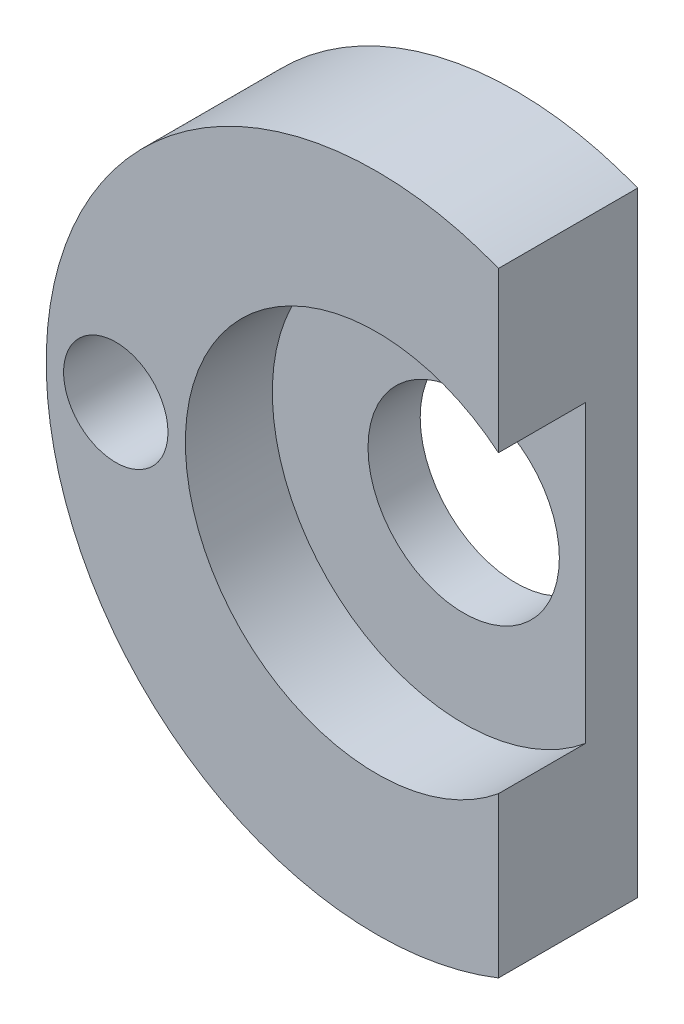
ISO-10303-21;
HEADER;
FILE_DESCRIPTION(('STEP AP214'),'2;1');
FILE_NAME('part.step','',(''),(''),'','','');
FILE_SCHEMA(('AUTOMOTIVE_DESIGN { 1 0 10303 214 1 1 1 1 }'));
ENDSEC;
DATA;
#1=APPLICATION_CONTEXT('core data for automotive mechanical design processes');
#2=APPLICATION_PROTOCOL_DEFINITION('international standard','automotive_design',2000,#1);
#3=PRODUCT_CONTEXT('',#1,'mechanical');
#4=PRODUCT('Part','Part','',(#3));
#5=PRODUCT_RELATED_PRODUCT_CATEGORY('part','',(#4));
#6=PRODUCT_DEFINITION_FORMATION('','',#4);
#7=PRODUCT_DEFINITION_CONTEXT('part definition',#1,'design');
#8=PRODUCT_DEFINITION('design','',#6,#7);
#9=PRODUCT_DEFINITION_SHAPE('','',#8);
#10=(LENGTH_UNIT() NAMED_UNIT(*) SI_UNIT(.MILLI.,.METRE.));
#11=(NAMED_UNIT(*) PLANE_ANGLE_UNIT() SI_UNIT($,.RADIAN.));
#12=(NAMED_UNIT(*) SI_UNIT($,.STERADIAN.) SOLID_ANGLE_UNIT());
#13=UNCERTAINTY_MEASURE_WITH_UNIT(LENGTH_MEASURE(1.E-05),#10,'distance_accuracy_value','');
#14=(GEOMETRIC_REPRESENTATION_CONTEXT(3) GLOBAL_UNCERTAINTY_ASSIGNED_CONTEXT((#13)) GLOBAL_UNIT_ASSIGNED_CONTEXT((#10,
#11,#12)) REPRESENTATION_CONTEXT('',''));
#15=CARTESIAN_POINT('',(0.,0.,0.));
#16=DIRECTION('',(0.,0.,1.));
#17=DIRECTION('',(1.,0.,0.));
#18=AXIS2_PLACEMENT_3D('',#15,#16,#17);
#19=CARTESIAN_POINT('',(0.,0.,4.));
#20=DIRECTION('',(0.,0.,-1.));
#21=DIRECTION('',(-1.,0.,0.));
#22=AXIS2_PLACEMENT_3D('',#19,#20,#21);
#23=CYLINDRICAL_SURFACE('',#22,2.75);
#24=CARTESIAN_POINT('',(0.,0.,0.));
#25=DIRECTION('',(0.,0.,1.));
#26=DIRECTION('',(1.,0.,0.));
#27=AXIS2_PLACEMENT_3D('',#24,#25,#26);
#28=CIRCLE('',#27,2.75);
#29=CARTESIAN_POINT('',(2.75,0.,0.));
#30=VERTEX_POINT('',#29);
#31=EDGE_CURVE('E104',#30,#30,#28,.T.);
#32=ORIENTED_EDGE('',*,*,#31,.F.);
#33=EDGE_LOOP('',(#32));
#34=FACE_BOUND('',#33,.T.);
#35=CARTESIAN_POINT('',(0.,0.,1.5));
#36=DIRECTION('',(0.,0.,1.));
#37=DIRECTION('',(1.,0.,0.));
#38=AXIS2_PLACEMENT_3D('',#35,#36,#37);
#39=CIRCLE('',#38,2.75);
#40=CARTESIAN_POINT('',(2.75,0.,1.5));
#41=VERTEX_POINT('',#40);
#42=EDGE_CURVE('E95',#41,#41,#39,.T.);
#43=ORIENTED_EDGE('',*,*,#42,.T.);
#44=EDGE_LOOP('',(#43));
#45=FACE_BOUND('',#44,.T.);
#46=ADVANCED_FACE('F33',(#34,#45),#23,.F.);
#47=CARTESIAN_POINT('',(0.,0.,4.));
#48=DIRECTION('',(0.,0.,1.));
#49=DIRECTION('',(1.,0.,0.));
#50=AXIS2_PLACEMENT_3D('',#47,#48,#49);
#51=PLANE('',#50);
#52=CARTESIAN_POINT('',(0.,0.,4.));
#53=DIRECTION('',(0.,0.,1.));
#54=DIRECTION('',(1.,0.,0.));
#55=AXIS2_PLACEMENT_3D('',#52,#53,#54);
#56=CIRCLE('',#55,5.5);
#57=CARTESIAN_POINT('',(3.5,4.24264068711928,4.));
#58=VERTEX_POINT('',#57);
#59=CARTESIAN_POINT('',(3.5,-4.24264068711928,4.));
#60=VERTEX_POINT('',#59);
#61=EDGE_CURVE('E75',#58,#60,#56,.T.);
#62=ORIENTED_EDGE('',*,*,#61,.F.);
#63=DIRECTION('',(0.,-1.,0.));
#64=VECTOR('',#63,1.);
#65=CARTESIAN_POINT('',(3.5,8.83176086632785,4.));
#66=LINE('',#65,#64);
#67=CARTESIAN_POINT('',(3.5,8.83176086632785,4.));
#68=VERTEX_POINT('',#67);
#69=EDGE_CURVE('E84',#68,#58,#66,.T.);
#70=ORIENTED_EDGE('',*,*,#69,.F.);
#71=CARTESIAN_POINT('',(0.,0.,4.));
#72=DIRECTION('',(0.,0.,1.));
#73=DIRECTION('',(1.,0.,0.));
#74=AXIS2_PLACEMENT_3D('',#71,#72,#73);
#75=CIRCLE('',#74,9.5);
#76=CARTESIAN_POINT('',(3.5,-8.83176086632785,4.));
#77=VERTEX_POINT('',#76);
#78=EDGE_CURVE('E110',#68,#77,#75,.T.);
#79=ORIENTED_EDGE('',*,*,#78,.T.);
#80=EDGE_CURVE('E54',#60,#77,#66,.T.);
#81=ORIENTED_EDGE('',*,*,#80,.F.);
#82=EDGE_LOOP('',(#62,#70,#79,#81));
#83=FACE_BOUND('',#82,.T.);
#84=CARTESIAN_POINT('',(-7.5,0.,4.));
#85=DIRECTION('',(0.,0.,1.));
#86=DIRECTION('',(1.,0.,0.));
#87=AXIS2_PLACEMENT_3D('',#84,#85,#86);
#88=CIRCLE('',#87,1.5);
#89=CARTESIAN_POINT('',(-6.,0.,4.));
#90=VERTEX_POINT('',#89);
#91=EDGE_CURVE('E101',#90,#90,#88,.T.);
#92=ORIENTED_EDGE('',*,*,#91,.F.);
#93=EDGE_LOOP('',(#92));
#94=FACE_BOUND('',#93,.T.);
#95=ADVANCED_FACE('F81',(#83,#94),#51,.T.);
#96=CARTESIAN_POINT('',(0.,0.,0.));
#97=DIRECTION('',(0.,0.,1.));
#98=DIRECTION('',(1.,0.,0.));
#99=AXIS2_PLACEMENT_3D('',#96,#97,#98);
#100=PLANE('',#99);
#101=CARTESIAN_POINT('',(0.,0.,0.));
#102=DIRECTION('',(0.,0.,1.));
#103=DIRECTION('',(1.,0.,0.));
#104=AXIS2_PLACEMENT_3D('',#101,#102,#103);
#105=CIRCLE('',#104,9.5);
#106=CARTESIAN_POINT('',(3.5,8.83176086632785,0.));
#107=VERTEX_POINT('',#106);
#108=CARTESIAN_POINT('',(3.5,-8.83176086632785,0.));
#109=VERTEX_POINT('',#108);
#110=EDGE_CURVE('E109',#107,#109,#105,.T.);
#111=ORIENTED_EDGE('',*,*,#110,.F.);
#112=DIRECTION('',(0.,-1.,0.));
#113=VECTOR('',#112,1.);
#114=CARTESIAN_POINT('',(3.5,8.83176086632785,0.));
#115=LINE('',#114,#113);
#116=EDGE_CURVE('E90',#107,#109,#115,.T.);
#117=ORIENTED_EDGE('',*,*,#116,.T.);
#118=EDGE_LOOP('',(#111,#117));
#119=FACE_BOUND('',#118,.T.);
#120=ORIENTED_EDGE('',*,*,#31,.T.);
#121=EDGE_LOOP('',(#120));
#122=FACE_BOUND('',#121,.T.);
#123=CARTESIAN_POINT('',(-7.5,0.,0.));
#124=DIRECTION('',(0.,0.,1.));
#125=DIRECTION('',(1.,0.,0.));
#126=AXIS2_PLACEMENT_3D('',#123,#124,#125);
#127=CIRCLE('',#126,1.5);
#128=CARTESIAN_POINT('',(-6.,0.,0.));
#129=VERTEX_POINT('',#128);
#130=EDGE_CURVE('E99',#129,#129,#127,.T.);
#131=ORIENTED_EDGE('',*,*,#130,.T.);
#132=EDGE_LOOP('',(#131));
#133=FACE_BOUND('',#132,.T.);
#134=ADVANCED_FACE('F129',(#119,#122,#133),#100,.F.);
#135=CARTESIAN_POINT('',(0.,0.,4.));
#136=DIRECTION('',(0.,0.,-1.));
#137=DIRECTION('',(-1.,0.,0.));
#138=AXIS2_PLACEMENT_3D('',#135,#136,#137);
#139=CYLINDRICAL_SURFACE('',#138,9.5);
#140=ORIENTED_EDGE('',*,*,#78,.F.);
#141=DIRECTION('',(0.,0.,1.));
#142=VECTOR('',#141,1.);
#143=CARTESIAN_POINT('',(3.5,8.83176086632785,0.));
#144=LINE('',#143,#142);
#145=EDGE_CURVE('E89',#107,#68,#144,.T.);
#146=ORIENTED_EDGE('',*,*,#145,.F.);
#147=ORIENTED_EDGE('',*,*,#110,.T.);
#148=DIRECTION('',(0.,0.,1.));
#149=VECTOR('',#148,1.);
#150=CARTESIAN_POINT('',(3.5,-8.83176086632785,0.));
#151=LINE('',#150,#149);
#152=EDGE_CURVE('E93',#109,#77,#151,.T.);
#153=ORIENTED_EDGE('',*,*,#152,.T.);
#154=EDGE_LOOP('',(#140,#146,#147,#153));
#155=FACE_BOUND('',#154,.T.);
#156=ADVANCED_FACE('F35',(#155),#139,.T.);
#157=CARTESIAN_POINT('',(-7.5,0.,4.));
#158=DIRECTION('',(0.,0.,-1.));
#159=DIRECTION('',(-1.,0.,0.));
#160=AXIS2_PLACEMENT_3D('',#157,#158,#159);
#161=CYLINDRICAL_SURFACE('',#160,1.5);
#162=ORIENTED_EDGE('',*,*,#91,.T.);
#163=EDGE_LOOP('',(#162));
#164=FACE_BOUND('',#163,.T.);
#165=ORIENTED_EDGE('',*,*,#130,.F.);
#166=EDGE_LOOP('',(#165));
#167=FACE_BOUND('',#166,.T.);
#168=ADVANCED_FACE('F134',(#164,#167),#161,.F.);
#169=CARTESIAN_POINT('',(3.5,8.83176086632785,0.));
#170=DIRECTION('',(-1.,0.,0.));
#171=DIRECTION('',(0.,0.,1.));
#172=AXIS2_PLACEMENT_3D('',#169,#170,#171);
#173=PLANE('',#172);
#174=DIRECTION('',(0.,1.,0.));
#175=VECTOR('',#174,1.);
#176=CARTESIAN_POINT('',(3.5,8.83176086632785,1.5));
#177=LINE('',#176,#175);
#178=CARTESIAN_POINT('',(3.5,-4.24264068711928,1.5));
#179=VERTEX_POINT('',#178);
#180=CARTESIAN_POINT('',(3.5,4.24264068711928,1.5));
#181=VERTEX_POINT('',#180);
#182=EDGE_CURVE('E78',#179,#181,#177,.T.);
#183=ORIENTED_EDGE('',*,*,#182,.F.);
#184=DIRECTION('',(0.,0.,1.));
#185=VECTOR('',#184,1.);
#186=CARTESIAN_POINT('',(3.5,-4.24264068711928,1.5));
#187=LINE('',#186,#185);
#188=EDGE_CURVE('E11',#179,#60,#187,.T.);
#189=ORIENTED_EDGE('',*,*,#188,.T.);
#190=ORIENTED_EDGE('',*,*,#80,.T.);
#191=ORIENTED_EDGE('',*,*,#152,.F.);
#192=ORIENTED_EDGE('',*,*,#116,.F.);
#193=ORIENTED_EDGE('',*,*,#145,.T.);
#194=ORIENTED_EDGE('',*,*,#69,.T.);
#195=DIRECTION('',(0.,0.,1.));
#196=VECTOR('',#195,1.);
#197=CARTESIAN_POINT('',(3.5,4.24264068711928,1.5));
#198=LINE('',#197,#196);
#199=EDGE_CURVE('E41',#58,#181,#198,.F.);
#200=ORIENTED_EDGE('',*,*,#199,.T.);
#201=EDGE_LOOP('',(#183,#189,#190,#191,#192,#193,#194,#200));
#202=FACE_BOUND('',#201,.T.);
#203=ADVANCED_FACE('F87',(#202),#173,.F.);
#204=CARTESIAN_POINT('',(0.,0.,1.5));
#205=DIRECTION('',(0.,0.,1.));
#206=DIRECTION('',(1.,0.,0.));
#207=AXIS2_PLACEMENT_3D('',#204,#205,#206);
#208=CYLINDRICAL_SURFACE('',#207,5.5);
#209=CARTESIAN_POINT('',(0.,0.,1.5));
#210=DIRECTION('',(0.,0.,1.));
#211=DIRECTION('',(1.,0.,0.));
#212=AXIS2_PLACEMENT_3D('',#209,#210,#211);
#213=CIRCLE('',#212,5.5);
#214=EDGE_CURVE('E47',#181,#179,#213,.T.);
#215=ORIENTED_EDGE('',*,*,#214,.F.);
#216=ORIENTED_EDGE('',*,*,#199,.F.);
#217=ORIENTED_EDGE('',*,*,#61,.T.);
#218=ORIENTED_EDGE('',*,*,#188,.F.);
#219=EDGE_LOOP('',(#215,#216,#217,#218));
#220=FACE_BOUND('',#219,.T.);
#221=ADVANCED_FACE('F74',(#220),#208,.F.);
#222=CARTESIAN_POINT('',(0.,0.,1.5));
#223=DIRECTION('',(0.,0.,1.));
#224=DIRECTION('',(1.,0.,0.));
#225=AXIS2_PLACEMENT_3D('',#222,#223,#224);
#226=PLANE('',#225);
#227=ORIENTED_EDGE('',*,*,#42,.F.);
#228=EDGE_LOOP('',(#227));
#229=FACE_BOUND('',#228,.T.);
#230=ORIENTED_EDGE('',*,*,#182,.T.);
#231=ORIENTED_EDGE('',*,*,#214,.T.);
#232=EDGE_LOOP('',(#230,#231));
#233=FACE_BOUND('',#232,.T.);
#234=ADVANCED_FACE('F114',(#229,#233),#226,.T.);
#235=CLOSED_SHELL('',(#46,#95,#134,#156,#168,#203,#221,#234));
#236=MANIFOLD_SOLID_BREP('B2',#235);
#237=ADVANCED_BREP_SHAPE_REPRESENTATION('',(#18,#236),#14);
#238=SHAPE_DEFINITION_REPRESENTATION(#9,#237);
ENDSEC;
END-ISO-10303-21;
